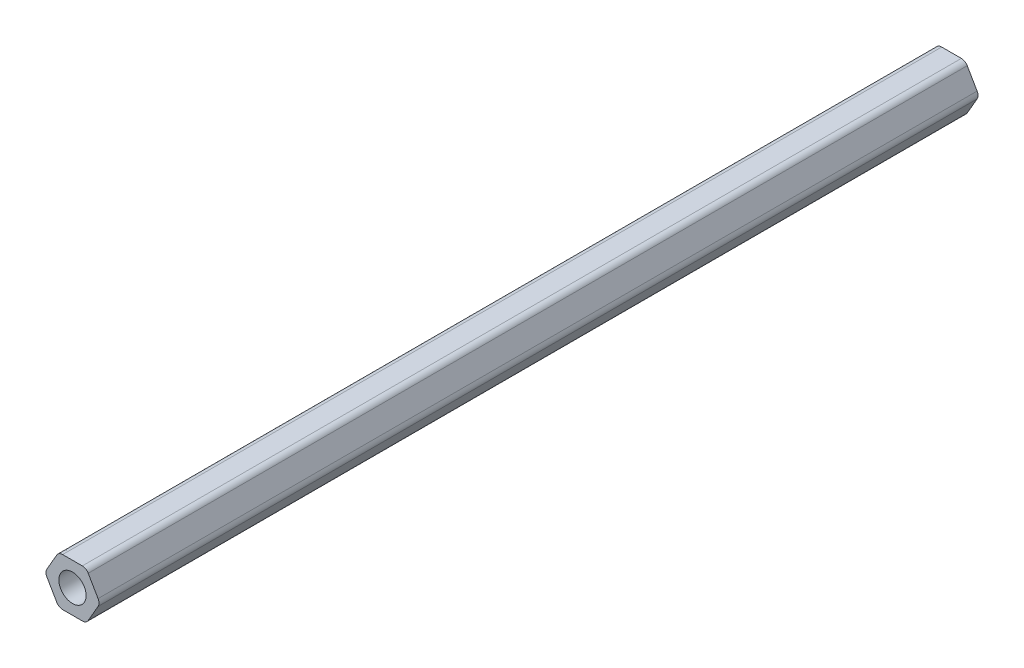
ISO-10303-21;
HEADER;
FILE_DESCRIPTION(('STEP AP214'),'2;1');
FILE_NAME('part.step','',(''),(''),'','','');
FILE_SCHEMA(('AUTOMOTIVE_DESIGN { 1 0 10303 214 1 1 1 1 }'));
ENDSEC;
DATA;
#1=APPLICATION_CONTEXT('core data for automotive mechanical design processes');
#2=APPLICATION_PROTOCOL_DEFINITION('international standard','automotive_design',2000,#1);
#3=PRODUCT_CONTEXT('',#1,'mechanical');
#4=PRODUCT('Part','Part','',(#3));
#5=PRODUCT_RELATED_PRODUCT_CATEGORY('part','',(#4));
#6=PRODUCT_DEFINITION_FORMATION('','',#4);
#7=PRODUCT_DEFINITION_CONTEXT('part definition',#1,'design');
#8=PRODUCT_DEFINITION('design','',#6,#7);
#9=PRODUCT_DEFINITION_SHAPE('','',#8);
#10=(LENGTH_UNIT() NAMED_UNIT(*) SI_UNIT(.MILLI.,.METRE.));
#11=(NAMED_UNIT(*) PLANE_ANGLE_UNIT() SI_UNIT($,.RADIAN.));
#12=(NAMED_UNIT(*) SI_UNIT($,.STERADIAN.) SOLID_ANGLE_UNIT());
#13=UNCERTAINTY_MEASURE_WITH_UNIT(LENGTH_MEASURE(1.E-05),#10,'distance_accuracy_value','');
#14=(GEOMETRIC_REPRESENTATION_CONTEXT(3) GLOBAL_UNCERTAINTY_ASSIGNED_CONTEXT((#13)) GLOBAL_UNIT_ASSIGNED_CONTEXT((#10,
#11,#12)) REPRESENTATION_CONTEXT('',''));
#15=CARTESIAN_POINT('',(0.,0.,0.));
#16=DIRECTION('',(0.,0.,1.));
#17=DIRECTION('',(1.,0.,0.));
#18=AXIS2_PLACEMENT_3D('',#15,#16,#17);
#19=CARTESIAN_POINT('',(-2.88675134594813,0.,129.));
#20=DIRECTION('',(0.,0.,-1.));
#21=DIRECTION('',(-1.,0.,0.));
#22=AXIS2_PLACEMENT_3D('',#19,#20,#21);
#23=CYLINDRICAL_SURFACE('',#22,1.);
#24=CARTESIAN_POINT('',(-2.88675134594813,0.,0.));
#25=DIRECTION('',(0.,0.,1.));
#26=DIRECTION('',(1.,0.,0.));
#27=AXIS2_PLACEMENT_3D('',#24,#25,#26);
#28=CIRCLE('',#27,1.);
#29=CARTESIAN_POINT('',(-3.75277674973257,0.500000000000003,0.));
#30=VERTEX_POINT('',#29);
#31=CARTESIAN_POINT('',(-3.75277674973257,-0.500000000000004,0.));
#32=VERTEX_POINT('',#31);
#33=EDGE_CURVE('E155',#30,#32,#28,.T.);
#34=ORIENTED_EDGE('',*,*,#33,.T.);
#35=DIRECTION('',(0.,0.,-1.));
#36=VECTOR('',#35,1.);
#37=CARTESIAN_POINT('',(-3.75277674973257,-0.500000000000004,129.));
#38=LINE('',#37,#36);
#39=CARTESIAN_POINT('',(-3.75277674973257,-0.500000000000004,129.));
#40=VERTEX_POINT('',#39);
#41=EDGE_CURVE('E11',#40,#32,#38,.T.);
#42=ORIENTED_EDGE('',*,*,#41,.F.);
#43=CARTESIAN_POINT('',(-2.88675134594813,0.,129.));
#44=DIRECTION('',(0.,0.,1.));
#45=DIRECTION('',(1.,0.,0.));
#46=AXIS2_PLACEMENT_3D('',#43,#44,#45);
#47=CIRCLE('',#46,1.);
#48=CARTESIAN_POINT('',(-3.75277674973257,0.500000000000003,129.));
#49=VERTEX_POINT('',#48);
#50=EDGE_CURVE('E178',#49,#40,#47,.T.);
#51=ORIENTED_EDGE('',*,*,#50,.F.);
#52=DIRECTION('',(0.,0.,-1.));
#53=VECTOR('',#52,1.);
#54=CARTESIAN_POINT('',(-3.75277674973257,0.500000000000003,129.));
#55=LINE('',#54,#53);
#56=EDGE_CURVE('E151',#49,#30,#55,.T.);
#57=ORIENTED_EDGE('',*,*,#56,.T.);
#58=EDGE_LOOP('',(#34,#42,#51,#57));
#59=FACE_BOUND('',#58,.T.);
#60=ADVANCED_FACE('F35',(#59),#23,.T.);
#61=CARTESIAN_POINT('',(-3.75277674973257,-0.500000000000004,129.));
#62=DIRECTION('',(0.866025403784439,0.5,0.));
#63=DIRECTION('',(-0.5,0.866025403784439,0.));
#64=AXIS2_PLACEMENT_3D('',#61,#62,#63);
#65=PLANE('',#64);
#66=DIRECTION('',(0.5,-0.866025403784439,0.));
#67=VECTOR('',#66,1.);
#68=CARTESIAN_POINT('',(-3.75277674973257,-0.500000000000004,0.));
#69=LINE('',#68,#67);
#70=CARTESIAN_POINT('',(-2.30940107675851,-3.,0.));
#71=VERTEX_POINT('',#70);
#72=EDGE_CURVE('E158',#32,#71,#69,.T.);
#73=ORIENTED_EDGE('',*,*,#72,.T.);
#74=DIRECTION('',(0.,0.,-1.));
#75=VECTOR('',#74,1.);
#76=CARTESIAN_POINT('',(-2.30940107675851,-3.,129.));
#77=LINE('',#76,#75);
#78=CARTESIAN_POINT('',(-2.30940107675851,-3.,129.));
#79=VERTEX_POINT('',#78);
#80=EDGE_CURVE('E43',#79,#71,#77,.T.);
#81=ORIENTED_EDGE('',*,*,#80,.F.);
#82=DIRECTION('',(0.5,-0.866025403784439,0.));
#83=VECTOR('',#82,1.);
#84=CARTESIAN_POINT('',(-3.75277674973257,-0.500000000000004,129.));
#85=LINE('',#84,#83);
#86=EDGE_CURVE('E106',#40,#79,#85,.T.);
#87=ORIENTED_EDGE('',*,*,#86,.F.);
#88=ORIENTED_EDGE('',*,*,#41,.T.);
#89=EDGE_LOOP('',(#73,#81,#87,#88));
#90=FACE_BOUND('',#89,.T.);
#91=ADVANCED_FACE('F257',(#90),#65,.F.);
#92=CARTESIAN_POINT('',(-1.44337567297407,-2.5,129.));
#93=DIRECTION('',(0.,0.,-1.));
#94=DIRECTION('',(-1.,0.,0.));
#95=AXIS2_PLACEMENT_3D('',#92,#93,#94);
#96=CYLINDRICAL_SURFACE('',#95,1.);
#97=CARTESIAN_POINT('',(-1.44337567297407,-2.5,0.));
#98=DIRECTION('',(0.,0.,1.));
#99=DIRECTION('',(1.,0.,0.));
#100=AXIS2_PLACEMENT_3D('',#97,#98,#99);
#101=CIRCLE('',#100,1.);
#102=CARTESIAN_POINT('',(-1.44337567297406,-3.5,0.));
#103=VERTEX_POINT('',#102);
#104=EDGE_CURVE('E161',#71,#103,#101,.T.);
#105=ORIENTED_EDGE('',*,*,#104,.T.);
#106=DIRECTION('',(0.,0.,-1.));
#107=VECTOR('',#106,1.);
#108=CARTESIAN_POINT('',(-1.44337567297406,-3.5,129.));
#109=LINE('',#108,#107);
#110=CARTESIAN_POINT('',(-1.44337567297406,-3.5,129.));
#111=VERTEX_POINT('',#110);
#112=EDGE_CURVE('E197',#111,#103,#109,.T.);
#113=ORIENTED_EDGE('',*,*,#112,.F.);
#114=CARTESIAN_POINT('',(-1.44337567297407,-2.5,129.));
#115=DIRECTION('',(0.,0.,1.));
#116=DIRECTION('',(1.,0.,0.));
#117=AXIS2_PLACEMENT_3D('',#114,#115,#116);
#118=CIRCLE('',#117,1.);
#119=EDGE_CURVE('E205',#79,#111,#118,.T.);
#120=ORIENTED_EDGE('',*,*,#119,.F.);
#121=ORIENTED_EDGE('',*,*,#80,.T.);
#122=EDGE_LOOP('',(#105,#113,#120,#121));
#123=FACE_BOUND('',#122,.T.);
#124=ADVANCED_FACE('F203',(#123),#96,.T.);
#125=CARTESIAN_POINT('',(-1.44337567297406,-3.5,129.));
#126=DIRECTION('',(0.,1.,0.));
#127=DIRECTION('',(-1.,0.,0.));
#128=AXIS2_PLACEMENT_3D('',#125,#126,#127);
#129=PLANE('',#128);
#130=DIRECTION('',(1.,0.,0.));
#131=VECTOR('',#130,1.);
#132=CARTESIAN_POINT('',(-1.44337567297406,-3.5,0.));
#133=LINE('',#132,#131);
#134=CARTESIAN_POINT('',(1.44337567297406,-3.5,0.));
#135=VERTEX_POINT('',#134);
#136=EDGE_CURVE('E163',#103,#135,#133,.T.);
#137=ORIENTED_EDGE('',*,*,#136,.T.);
#138=DIRECTION('',(0.,0.,-1.));
#139=VECTOR('',#138,1.);
#140=CARTESIAN_POINT('',(1.44337567297406,-3.5,129.));
#141=LINE('',#140,#139);
#142=CARTESIAN_POINT('',(1.44337567297406,-3.5,129.));
#143=VERTEX_POINT('',#142);
#144=EDGE_CURVE('E194',#143,#135,#141,.T.);
#145=ORIENTED_EDGE('',*,*,#144,.F.);
#146=DIRECTION('',(1.,0.,0.));
#147=VECTOR('',#146,1.);
#148=CARTESIAN_POINT('',(-1.44337567297406,-3.5,129.));
#149=LINE('',#148,#147);
#150=EDGE_CURVE('E223',#111,#143,#149,.T.);
#151=ORIENTED_EDGE('',*,*,#150,.F.);
#152=ORIENTED_EDGE('',*,*,#112,.T.);
#153=EDGE_LOOP('',(#137,#145,#151,#152));
#154=FACE_BOUND('',#153,.T.);
#155=ADVANCED_FACE('F214',(#154),#129,.F.);
#156=CARTESIAN_POINT('',(1.44337567297406,-2.5,129.));
#157=DIRECTION('',(0.,0.,-1.));
#158=DIRECTION('',(-1.,0.,0.));
#159=AXIS2_PLACEMENT_3D('',#156,#157,#158);
#160=CYLINDRICAL_SURFACE('',#159,1.);
#161=CARTESIAN_POINT('',(1.44337567297406,-2.5,0.));
#162=DIRECTION('',(0.,0.,1.));
#163=DIRECTION('',(1.,0.,0.));
#164=AXIS2_PLACEMENT_3D('',#161,#162,#163);
#165=CIRCLE('',#164,1.);
#166=CARTESIAN_POINT('',(2.30940107675851,-3.,0.));
#167=VERTEX_POINT('',#166);
#168=EDGE_CURVE('E165',#135,#167,#165,.T.);
#169=ORIENTED_EDGE('',*,*,#168,.T.);
#170=DIRECTION('',(0.,0.,-1.));
#171=VECTOR('',#170,1.);
#172=CARTESIAN_POINT('',(2.30940107675851,-3.,129.));
#173=LINE('',#172,#171);
#174=CARTESIAN_POINT('',(2.30940107675851,-3.,129.));
#175=VERTEX_POINT('',#174);
#176=EDGE_CURVE('E191',#175,#167,#173,.T.);
#177=ORIENTED_EDGE('',*,*,#176,.F.);
#178=CARTESIAN_POINT('',(1.44337567297406,-2.5,129.));
#179=DIRECTION('',(0.,0.,1.));
#180=DIRECTION('',(1.,0.,0.));
#181=AXIS2_PLACEMENT_3D('',#178,#179,#180);
#182=CIRCLE('',#181,1.);
#183=EDGE_CURVE('E220',#143,#175,#182,.T.);
#184=ORIENTED_EDGE('',*,*,#183,.F.);
#185=ORIENTED_EDGE('',*,*,#144,.T.);
#186=EDGE_LOOP('',(#169,#177,#184,#185));
#187=FACE_BOUND('',#186,.T.);
#188=ADVANCED_FACE('F218',(#187),#160,.T.);
#189=CARTESIAN_POINT('',(2.30940107675851,-3.,129.));
#190=DIRECTION('',(-0.866025403784439,0.5,0.));
#191=DIRECTION('',(-0.5,-0.866025403784439,0.));
#192=AXIS2_PLACEMENT_3D('',#189,#190,#191);
#193=PLANE('',#192);
#194=DIRECTION('',(0.5,0.866025403784439,0.));
#195=VECTOR('',#194,1.);
#196=CARTESIAN_POINT('',(2.30940107675851,-3.,0.));
#197=LINE('',#196,#195);
#198=CARTESIAN_POINT('',(3.75277674973256,-0.500000000000002,0.));
#199=VERTEX_POINT('',#198);
#200=EDGE_CURVE('E167',#167,#199,#197,.T.);
#201=ORIENTED_EDGE('',*,*,#200,.T.);
#202=DIRECTION('',(0.,0.,-1.));
#203=VECTOR('',#202,1.);
#204=CARTESIAN_POINT('',(3.75277674973256,-0.500000000000002,129.));
#205=LINE('',#204,#203);
#206=CARTESIAN_POINT('',(3.75277674973256,-0.500000000000002,129.));
#207=VERTEX_POINT('',#206);
#208=EDGE_CURVE('E188',#207,#199,#205,.T.);
#209=ORIENTED_EDGE('',*,*,#208,.F.);
#210=DIRECTION('',(0.5,0.866025403784439,0.));
#211=VECTOR('',#210,1.);
#212=CARTESIAN_POINT('',(2.30940107675851,-3.,129.));
#213=LINE('',#212,#211);
#214=EDGE_CURVE('E222',#175,#207,#213,.T.);
#215=ORIENTED_EDGE('',*,*,#214,.F.);
#216=ORIENTED_EDGE('',*,*,#176,.T.);
#217=EDGE_LOOP('',(#201,#209,#215,#216));
#218=FACE_BOUND('',#217,.T.);
#219=ADVANCED_FACE('F270',(#218),#193,.F.);
#220=CARTESIAN_POINT('',(2.88675134594813,0.,129.));
#221=DIRECTION('',(0.,0.,-1.));
#222=DIRECTION('',(-1.,0.,0.));
#223=AXIS2_PLACEMENT_3D('',#220,#221,#222);
#224=CYLINDRICAL_SURFACE('',#223,1.);
#225=CARTESIAN_POINT('',(2.88675134594813,0.,0.));
#226=DIRECTION('',(0.,0.,1.));
#227=DIRECTION('',(-1.,0.,0.));
#228=AXIS2_PLACEMENT_3D('',#225,#226,#227);
#229=CIRCLE('',#228,1.);
#230=CARTESIAN_POINT('',(3.75277674973256,0.500000000000006,0.));
#231=VERTEX_POINT('',#230);
#232=EDGE_CURVE('E169',#199,#231,#229,.T.);
#233=ORIENTED_EDGE('',*,*,#232,.T.);
#234=DIRECTION('',(0.,0.,-1.));
#235=VECTOR('',#234,1.);
#236=CARTESIAN_POINT('',(3.75277674973256,0.500000000000006,129.));
#237=LINE('',#236,#235);
#238=CARTESIAN_POINT('',(3.75277674973256,0.500000000000006,129.));
#239=VERTEX_POINT('',#238);
#240=EDGE_CURVE('E185',#239,#231,#237,.T.);
#241=ORIENTED_EDGE('',*,*,#240,.F.);
#242=CARTESIAN_POINT('',(2.88675134594813,0.,129.));
#243=DIRECTION('',(0.,0.,1.));
#244=DIRECTION('',(-1.,0.,0.));
#245=AXIS2_PLACEMENT_3D('',#242,#243,#244);
#246=CIRCLE('',#245,1.);
#247=EDGE_CURVE('E225',#207,#239,#246,.T.);
#248=ORIENTED_EDGE('',*,*,#247,.F.);
#249=ORIENTED_EDGE('',*,*,#208,.T.);
#250=EDGE_LOOP('',(#233,#241,#248,#249));
#251=FACE_BOUND('',#250,.T.);
#252=ADVANCED_FACE('F273',(#251),#224,.T.);
#253=CARTESIAN_POINT('',(3.75277674973256,0.500000000000006,129.));
#254=DIRECTION('',(-0.866025403784438,-0.5,0.));
#255=DIRECTION('',(0.5,-0.866025403784439,0.));
#256=AXIS2_PLACEMENT_3D('',#253,#254,#255);
#257=PLANE('',#256);
#258=DIRECTION('',(-0.5,0.866025403784439,0.));
#259=VECTOR('',#258,1.);
#260=CARTESIAN_POINT('',(3.75277674973256,0.500000000000006,0.));
#261=LINE('',#260,#259);
#262=CARTESIAN_POINT('',(2.3094010767585,3.,0.));
#263=VERTEX_POINT('',#262);
#264=EDGE_CURVE('E171',#231,#263,#261,.T.);
#265=ORIENTED_EDGE('',*,*,#264,.T.);
#266=DIRECTION('',(0.,0.,-1.));
#267=VECTOR('',#266,1.);
#268=CARTESIAN_POINT('',(2.3094010767585,3.,129.));
#269=LINE('',#268,#267);
#270=CARTESIAN_POINT('',(2.3094010767585,3.,129.));
#271=VERTEX_POINT('',#270);
#272=EDGE_CURVE('E182',#271,#263,#269,.T.);
#273=ORIENTED_EDGE('',*,*,#272,.F.);
#274=DIRECTION('',(-0.5,0.866025403784439,0.));
#275=VECTOR('',#274,1.);
#276=CARTESIAN_POINT('',(3.75277674973256,0.500000000000006,129.));
#277=LINE('',#276,#275);
#278=EDGE_CURVE('E231',#239,#271,#277,.T.);
#279=ORIENTED_EDGE('',*,*,#278,.F.);
#280=ORIENTED_EDGE('',*,*,#240,.T.);
#281=EDGE_LOOP('',(#265,#273,#279,#280));
#282=FACE_BOUND('',#281,.T.);
#283=ADVANCED_FACE('F237',(#282),#257,.F.);
#284=CARTESIAN_POINT('',(1.44337567297406,2.5,129.));
#285=DIRECTION('',(0.,0.,-1.));
#286=DIRECTION('',(-1.,0.,0.));
#287=AXIS2_PLACEMENT_3D('',#284,#285,#286);
#288=CYLINDRICAL_SURFACE('',#287,1.);
#289=CARTESIAN_POINT('',(1.44337567297406,2.5,0.));
#290=DIRECTION('',(0.,0.,1.));
#291=DIRECTION('',(1.,0.,0.));
#292=AXIS2_PLACEMENT_3D('',#289,#290,#291);
#293=CIRCLE('',#292,1.);
#294=CARTESIAN_POINT('',(1.44337567297406,3.5,0.));
#295=VERTEX_POINT('',#294);
#296=EDGE_CURVE('E173',#263,#295,#293,.T.);
#297=ORIENTED_EDGE('',*,*,#296,.T.);
#298=DIRECTION('',(0.,0.,-1.));
#299=VECTOR('',#298,1.);
#300=CARTESIAN_POINT('',(1.44337567297406,3.5,129.));
#301=LINE('',#300,#299);
#302=CARTESIAN_POINT('',(1.44337567297406,3.5,129.));
#303=VERTEX_POINT('',#302);
#304=EDGE_CURVE('E146',#303,#295,#301,.T.);
#305=ORIENTED_EDGE('',*,*,#304,.F.);
#306=CARTESIAN_POINT('',(1.44337567297406,2.5,129.));
#307=DIRECTION('',(0.,0.,1.));
#308=DIRECTION('',(1.,0.,0.));
#309=AXIS2_PLACEMENT_3D('',#306,#307,#308);
#310=CIRCLE('',#309,1.);
#311=EDGE_CURVE('E137',#271,#303,#310,.T.);
#312=ORIENTED_EDGE('',*,*,#311,.F.);
#313=ORIENTED_EDGE('',*,*,#272,.T.);
#314=EDGE_LOOP('',(#297,#305,#312,#313));
#315=FACE_BOUND('',#314,.T.);
#316=ADVANCED_FACE('F241',(#315),#288,.T.);
#317=CARTESIAN_POINT('',(1.44337567297406,3.5,129.));
#318=DIRECTION('',(0.,-1.,0.));
#319=DIRECTION('',(0.,0.,-1.));
#320=AXIS2_PLACEMENT_3D('',#317,#318,#319);
#321=PLANE('',#320);
#322=DIRECTION('',(-1.,0.,0.));
#323=VECTOR('',#322,1.);
#324=CARTESIAN_POINT('',(1.44337567297406,3.5,0.));
#325=LINE('',#324,#323);
#326=CARTESIAN_POINT('',(-1.44337567297406,3.5,0.));
#327=VERTEX_POINT('',#326);
#328=EDGE_CURVE('E145',#295,#327,#325,.T.);
#329=ORIENTED_EDGE('',*,*,#328,.T.);
#330=DIRECTION('',(0.,0.,-1.));
#331=VECTOR('',#330,1.);
#332=CARTESIAN_POINT('',(-1.44337567297406,3.5,129.));
#333=LINE('',#332,#331);
#334=CARTESIAN_POINT('',(-1.44337567297406,3.5,129.));
#335=VERTEX_POINT('',#334);
#336=EDGE_CURVE('E142',#335,#327,#333,.T.);
#337=ORIENTED_EDGE('',*,*,#336,.F.);
#338=DIRECTION('',(-1.,0.,0.));
#339=VECTOR('',#338,1.);
#340=CARTESIAN_POINT('',(1.44337567297406,3.5,129.));
#341=LINE('',#340,#339);
#342=EDGE_CURVE('E131',#303,#335,#341,.T.);
#343=ORIENTED_EDGE('',*,*,#342,.F.);
#344=ORIENTED_EDGE('',*,*,#304,.T.);
#345=EDGE_LOOP('',(#329,#337,#343,#344));
#346=FACE_BOUND('',#345,.T.);
#347=ADVANCED_FACE('F143',(#346),#321,.F.);
#348=CARTESIAN_POINT('',(-1.44337567297407,2.5,129.));
#349=DIRECTION('',(0.,0.,-1.));
#350=DIRECTION('',(-1.,0.,0.));
#351=AXIS2_PLACEMENT_3D('',#348,#349,#350);
#352=CYLINDRICAL_SURFACE('',#351,1.);
#353=CARTESIAN_POINT('',(-1.44337567297407,2.5,0.));
#354=DIRECTION('',(0.,0.,1.));
#355=DIRECTION('',(1.,0.,0.));
#356=AXIS2_PLACEMENT_3D('',#353,#354,#355);
#357=CIRCLE('',#356,1.);
#358=CARTESIAN_POINT('',(-2.30940107675851,3.,0.));
#359=VERTEX_POINT('',#358);
#360=EDGE_CURVE('E92',#327,#359,#357,.T.);
#361=ORIENTED_EDGE('',*,*,#360,.T.);
#362=DIRECTION('',(0.,0.,-1.));
#363=VECTOR('',#362,1.);
#364=CARTESIAN_POINT('',(-2.30940107675851,3.,129.));
#365=LINE('',#364,#363);
#366=CARTESIAN_POINT('',(-2.30940107675851,3.,129.));
#367=VERTEX_POINT('',#366);
#368=EDGE_CURVE('E147',#367,#359,#365,.T.);
#369=ORIENTED_EDGE('',*,*,#368,.F.);
#370=CARTESIAN_POINT('',(-1.44337567297407,2.5,129.));
#371=DIRECTION('',(0.,0.,1.));
#372=DIRECTION('',(1.,0.,0.));
#373=AXIS2_PLACEMENT_3D('',#370,#371,#372);
#374=CIRCLE('',#373,1.);
#375=EDGE_CURVE('E135',#335,#367,#374,.T.);
#376=ORIENTED_EDGE('',*,*,#375,.F.);
#377=ORIENTED_EDGE('',*,*,#336,.T.);
#378=EDGE_LOOP('',(#361,#369,#376,#377));
#379=FACE_BOUND('',#378,.T.);
#380=ADVANCED_FACE('F149',(#379),#352,.T.);
#381=CARTESIAN_POINT('',(-2.30940107675851,3.,129.));
#382=DIRECTION('',(0.866025403784439,-0.5,0.));
#383=DIRECTION('',(0.5,0.866025403784439,0.));
#384=AXIS2_PLACEMENT_3D('',#381,#382,#383);
#385=PLANE('',#384);
#386=DIRECTION('',(-0.5,-0.866025403784439,0.));
#387=VECTOR('',#386,1.);
#388=CARTESIAN_POINT('',(-2.30940107675851,3.,0.));
#389=LINE('',#388,#387);
#390=EDGE_CURVE('E98',#359,#30,#389,.T.);
#391=ORIENTED_EDGE('',*,*,#390,.T.);
#392=ORIENTED_EDGE('',*,*,#56,.F.);
#393=DIRECTION('',(-0.5,-0.866025403784439,0.));
#394=VECTOR('',#393,1.);
#395=CARTESIAN_POINT('',(-2.30940107675851,3.,129.));
#396=LINE('',#395,#394);
#397=EDGE_CURVE('E51',#367,#49,#396,.T.);
#398=ORIENTED_EDGE('',*,*,#397,.F.);
#399=ORIENTED_EDGE('',*,*,#368,.T.);
#400=EDGE_LOOP('',(#391,#392,#398,#399));
#401=FACE_BOUND('',#400,.T.);
#402=ADVANCED_FACE('F245',(#401),#385,.F.);
#403=CARTESIAN_POINT('',(-2.88675134594813,0.,129.));
#404=DIRECTION('',(0.,0.,1.));
#405=DIRECTION('',(1.,0.,0.));
#406=AXIS2_PLACEMENT_3D('',#403,#404,#405);
#407=PLANE('',#406);
#408=CARTESIAN_POINT('',(0.,0.,129.));
#409=DIRECTION('',(0.,0.,1.));
#410=DIRECTION('',(1.,0.,0.));
#411=AXIS2_PLACEMENT_3D('',#408,#409,#410);
#412=CIRCLE('',#411,2.);
#413=CARTESIAN_POINT('',(2.,0.,129.));
#414=VERTEX_POINT('',#413);
#415=EDGE_CURVE('E356',#414,#414,#412,.T.);
#416=ORIENTED_EDGE('',*,*,#415,.F.);
#417=EDGE_LOOP('',(#416));
#418=FACE_BOUND('',#417,.T.);
#419=ORIENTED_EDGE('',*,*,#50,.T.);
#420=ORIENTED_EDGE('',*,*,#86,.T.);
#421=ORIENTED_EDGE('',*,*,#119,.T.);
#422=ORIENTED_EDGE('',*,*,#150,.T.);
#423=ORIENTED_EDGE('',*,*,#183,.T.);
#424=ORIENTED_EDGE('',*,*,#214,.T.);
#425=ORIENTED_EDGE('',*,*,#247,.T.);
#426=ORIENTED_EDGE('',*,*,#278,.T.);
#427=ORIENTED_EDGE('',*,*,#311,.T.);
#428=ORIENTED_EDGE('',*,*,#342,.T.);
#429=ORIENTED_EDGE('',*,*,#375,.T.);
#430=ORIENTED_EDGE('',*,*,#397,.T.);
#431=EDGE_LOOP('',(#419,#420,#421,#422,#423,#424,#425,#426,#427,#428,#429,#430));
#432=FACE_BOUND('',#431,.T.);
#433=ADVANCED_FACE('F133',(#418,#432),#407,.T.);
#434=CARTESIAN_POINT('',(-2.88675134594813,0.,0.));
#435=DIRECTION('',(0.,0.,1.));
#436=DIRECTION('',(1.,0.,0.));
#437=AXIS2_PLACEMENT_3D('',#434,#435,#436);
#438=PLANE('',#437);
#439=CARTESIAN_POINT('',(0.,0.,0.));
#440=DIRECTION('',(0.,0.,-1.));
#441=DIRECTION('',(-1.,0.,0.));
#442=AXIS2_PLACEMENT_3D('',#439,#440,#441);
#443=CIRCLE('',#442,2.);
#444=CARTESIAN_POINT('',(-2.,0.,0.));
#445=VERTEX_POINT('',#444);
#446=EDGE_CURVE('E357',#445,#445,#443,.T.);
#447=ORIENTED_EDGE('',*,*,#446,.F.);
#448=EDGE_LOOP('',(#447));
#449=FACE_BOUND('',#448,.T.);
#450=ORIENTED_EDGE('',*,*,#33,.F.);
#451=ORIENTED_EDGE('',*,*,#390,.F.);
#452=ORIENTED_EDGE('',*,*,#360,.F.);
#453=ORIENTED_EDGE('',*,*,#328,.F.);
#454=ORIENTED_EDGE('',*,*,#296,.F.);
#455=ORIENTED_EDGE('',*,*,#264,.F.);
#456=ORIENTED_EDGE('',*,*,#232,.F.);
#457=ORIENTED_EDGE('',*,*,#200,.F.);
#458=ORIENTED_EDGE('',*,*,#168,.F.);
#459=ORIENTED_EDGE('',*,*,#136,.F.);
#460=ORIENTED_EDGE('',*,*,#104,.F.);
#461=ORIENTED_EDGE('',*,*,#72,.F.);
#462=EDGE_LOOP('',(#450,#451,#452,#453,#454,#455,#456,#457,#458,#459,#460,#461));
#463=FACE_BOUND('',#462,.T.);
#464=ADVANCED_FACE('F209',(#449,#463),#438,.F.);
#465=CARTESIAN_POINT('',(0.,0.,123.));
#466=DIRECTION('',(0.,0.,1.));
#467=DIRECTION('',(1.,0.,0.));
#468=AXIS2_PLACEMENT_3D('',#465,#466,#467);
#469=CYLINDRICAL_SURFACE('',#468,2.);
#470=CARTESIAN_POINT('',(0.,0.,123.));
#471=DIRECTION('',(0.,0.,1.));
#472=DIRECTION('',(1.,0.,0.));
#473=AXIS2_PLACEMENT_3D('',#470,#471,#472);
#474=CIRCLE('',#473,2.);
#475=CARTESIAN_POINT('',(2.,0.,123.));
#476=VERTEX_POINT('',#475);
#477=EDGE_CURVE('E159',#476,#476,#474,.T.);
#478=ORIENTED_EDGE('',*,*,#477,.F.);
#479=EDGE_LOOP('',(#478));
#480=FACE_BOUND('',#479,.T.);
#481=ORIENTED_EDGE('',*,*,#415,.T.);
#482=EDGE_LOOP('',(#481));
#483=FACE_BOUND('',#482,.T.);
#484=ADVANCED_FACE('F308',(#480,#483),#469,.F.);
#485=CARTESIAN_POINT('',(0.,0.,123.));
#486=DIRECTION('',(0.,0.,1.));
#487=DIRECTION('',(1.,0.,0.));
#488=AXIS2_PLACEMENT_3D('',#485,#486,#487);
#489=PLANE('',#488);
#490=ORIENTED_EDGE('',*,*,#477,.T.);
#491=EDGE_LOOP('',(#490));
#492=FACE_BOUND('',#491,.T.);
#493=ADVANCED_FACE('F313',(#492),#489,.T.);
#494=CARTESIAN_POINT('',(0.,0.,6.));
#495=DIRECTION('',(0.,0.,-1.));
#496=DIRECTION('',(-1.,0.,0.));
#497=AXIS2_PLACEMENT_3D('',#494,#495,#496);
#498=CYLINDRICAL_SURFACE('',#497,2.);
#499=CARTESIAN_POINT('',(0.,0.,6.));
#500=DIRECTION('',(0.,0.,-1.));
#501=DIRECTION('',(-1.,0.,0.));
#502=AXIS2_PLACEMENT_3D('',#499,#500,#501);
#503=CIRCLE('',#502,2.);
#504=CARTESIAN_POINT('',(-2.,0.,6.));
#505=VERTEX_POINT('',#504);
#506=EDGE_CURVE('E355',#505,#505,#503,.T.);
#507=ORIENTED_EDGE('',*,*,#506,.F.);
#508=EDGE_LOOP('',(#507));
#509=FACE_BOUND('',#508,.T.);
#510=ORIENTED_EDGE('',*,*,#446,.T.);
#511=EDGE_LOOP('',(#510));
#512=FACE_BOUND('',#511,.T.);
#513=ADVANCED_FACE('F323',(#509,#512),#498,.F.);
#514=CARTESIAN_POINT('',(0.,0.,6.));
#515=DIRECTION('',(0.,0.,-1.));
#516=DIRECTION('',(-1.,0.,0.));
#517=AXIS2_PLACEMENT_3D('',#514,#515,#516);
#518=PLANE('',#517);
#519=ORIENTED_EDGE('',*,*,#506,.T.);
#520=EDGE_LOOP('',(#519));
#521=FACE_BOUND('',#520,.T.);
#522=ADVANCED_FACE('F339',(#521),#518,.T.);
#523=CLOSED_SHELL('',(#60,#91,#124,#155,#188,#219,#252,#283,#316,#347,#380,#402,#433,#464,#484,
#493,#513,#522));
#524=MANIFOLD_SOLID_BREP('B2',#523);
#525=ADVANCED_BREP_SHAPE_REPRESENTATION('',(#18,#524),#14);
#526=SHAPE_DEFINITION_REPRESENTATION(#9,#525);
ENDSEC;
END-ISO-10303-21;
